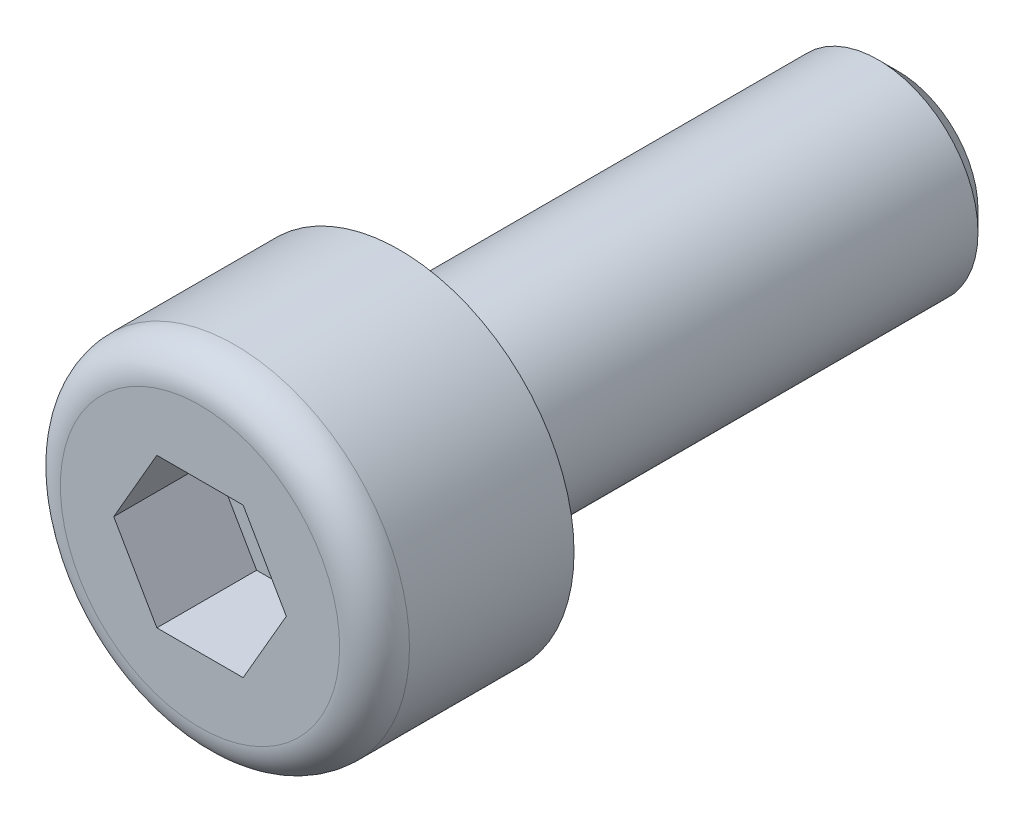
ISO-10303-21;
HEADER;
FILE_DESCRIPTION(('STEP AP214'),'2;1');
FILE_NAME('part.step','',(''),(''),'','','');
FILE_SCHEMA(('AUTOMOTIVE_DESIGN { 1 0 10303 214 1 1 1 1 }'));
ENDSEC;
DATA;
#1=APPLICATION_CONTEXT('core data for automotive mechanical design processes');
#2=APPLICATION_PROTOCOL_DEFINITION('international standard','automotive_design',2000,#1);
#3=PRODUCT_CONTEXT('',#1,'mechanical');
#4=PRODUCT('Part','Part','',(#3));
#5=PRODUCT_RELATED_PRODUCT_CATEGORY('part','',(#4));
#6=PRODUCT_DEFINITION_FORMATION('','',#4);
#7=PRODUCT_DEFINITION_CONTEXT('part definition',#1,'design');
#8=PRODUCT_DEFINITION('design','',#6,#7);
#9=PRODUCT_DEFINITION_SHAPE('','',#8);
#10=(LENGTH_UNIT() NAMED_UNIT(*) SI_UNIT(.MILLI.,.METRE.));
#11=(NAMED_UNIT(*) PLANE_ANGLE_UNIT() SI_UNIT($,.RADIAN.));
#12=(NAMED_UNIT(*) SI_UNIT($,.STERADIAN.) SOLID_ANGLE_UNIT());
#13=UNCERTAINTY_MEASURE_WITH_UNIT(LENGTH_MEASURE(1.E-05),#10,'distance_accuracy_value','');
#14=(GEOMETRIC_REPRESENTATION_CONTEXT(3) GLOBAL_UNCERTAINTY_ASSIGNED_CONTEXT((#13)) GLOBAL_UNIT_ASSIGNED_CONTEXT((#10,
#11,#12)) REPRESENTATION_CONTEXT('',''));
#15=CARTESIAN_POINT('',(0.,0.,0.));
#16=DIRECTION('',(0.,0.,1.));
#17=DIRECTION('',(1.,0.,0.));
#18=AXIS2_PLACEMENT_3D('',#15,#16,#17);
#19=CARTESIAN_POINT('',(0.,0.,-10.));
#20=DIRECTION('',(0.,0.,1.));
#21=DIRECTION('',(1.,0.,0.));
#22=AXIS2_PLACEMENT_3D('',#19,#20,#21);
#23=PLANE('',#22);
#24=CARTESIAN_POINT('',(0.,0.,-10.));
#25=DIRECTION('',(0.,0.,1.));
#26=DIRECTION('',(1.,0.,0.));
#27=AXIS2_PLACEMENT_3D('',#24,#25,#26);
#28=CIRCLE('',#27,1.6);
#29=CARTESIAN_POINT('',(1.6,0.,-10.));
#30=VERTEX_POINT('',#29);
#31=EDGE_CURVE('E10',#30,#30,#28,.T.);
#32=ORIENTED_EDGE('',*,*,#31,.F.);
#33=EDGE_LOOP('',(#32));
#34=FACE_BOUND('',#33,.T.);
#35=ADVANCED_FACE('F16',(#34),#23,.F.);
#36=CARTESIAN_POINT('',(0.,0.,-10.));
#37=DIRECTION('',(0.,0.,1.));
#38=DIRECTION('',(1.,0.,0.));
#39=AXIS2_PLACEMENT_3D('',#36,#37,#38);
#40=CONICAL_SURFACE('',#39,1.6,0.785398163397);
#41=ORIENTED_EDGE('',*,*,#31,.T.);
#42=DIRECTION('',(0.707106781186548,0.,0.707106781186548));
#43=VECTOR('',#42,1.);
#44=CARTESIAN_POINT('',(1.6,0.,-10.));
#45=LINE('',#44,#43);
#46=CARTESIAN_POINT('',(2.,0.,-9.6));
#47=VERTEX_POINT('',#46);
#48=EDGE_CURVE('E27',#30,#47,#45,.T.);
#49=ORIENTED_EDGE('',*,*,#48,.T.);
#50=CARTESIAN_POINT('',(0.,0.,-9.6));
#51=DIRECTION('',(0.,0.,1.));
#52=DIRECTION('',(1.,0.,0.));
#53=AXIS2_PLACEMENT_3D('',#50,#51,#52);
#54=CIRCLE('',#53,2.);
#55=EDGE_CURVE('E148',#47,#47,#54,.T.);
#56=ORIENTED_EDGE('',*,*,#55,.F.);
#57=ORIENTED_EDGE('',*,*,#48,.F.);
#58=EDGE_LOOP('',(#41,#49,#56,#57));
#59=FACE_BOUND('',#58,.T.);
#60=ADVANCED_FACE('F289',(#59),#40,.T.);
#61=CARTESIAN_POINT('',(0.,0.,-9.6));
#62=DIRECTION('',(0.,0.,1.));
#63=DIRECTION('',(1.,0.,0.));
#64=AXIS2_PLACEMENT_3D('',#61,#62,#63);
#65=CYLINDRICAL_SURFACE('',#64,2.);
#66=ORIENTED_EDGE('',*,*,#55,.T.);
#67=DIRECTION('',(0.,0.,1.));
#68=VECTOR('',#67,1.);
#69=CARTESIAN_POINT('',(2.,0.,-9.6));
#70=LINE('',#69,#68);
#71=CARTESIAN_POINT('',(2.,0.,0.));
#72=VERTEX_POINT('',#71);
#73=EDGE_CURVE('E119',#47,#72,#70,.T.);
#74=ORIENTED_EDGE('',*,*,#73,.T.);
#75=CARTESIAN_POINT('',(0.,0.,0.));
#76=DIRECTION('',(0.,0.,1.));
#77=DIRECTION('',(1.,0.,0.));
#78=AXIS2_PLACEMENT_3D('',#75,#76,#77);
#79=CIRCLE('',#78,2.);
#80=EDGE_CURVE('E111',#72,#72,#79,.T.);
#81=ORIENTED_EDGE('',*,*,#80,.F.);
#82=ORIENTED_EDGE('',*,*,#73,.F.);
#83=EDGE_LOOP('',(#66,#74,#81,#82));
#84=FACE_BOUND('',#83,.T.);
#85=ADVANCED_FACE('F329',(#84),#65,.T.);
#86=CARTESIAN_POINT('',(0.,0.,0.));
#87=DIRECTION('',(0.,0.,1.));
#88=DIRECTION('',(1.,0.,0.));
#89=AXIS2_PLACEMENT_3D('',#86,#87,#88);
#90=PLANE('',#89);
#91=ORIENTED_EDGE('',*,*,#80,.T.);
#92=EDGE_LOOP('',(#91));
#93=FACE_BOUND('',#92,.T.);
#94=CARTESIAN_POINT('',(0.,0.,0.));
#95=DIRECTION('',(0.,0.,1.));
#96=DIRECTION('',(1.,0.,0.));
#97=AXIS2_PLACEMENT_3D('',#94,#95,#96);
#98=CIRCLE('',#97,3.5);
#99=CARTESIAN_POINT('',(3.5,0.,0.));
#100=VERTEX_POINT('',#99);
#101=EDGE_CURVE('E105',#100,#100,#98,.T.);
#102=ORIENTED_EDGE('',*,*,#101,.F.);
#103=EDGE_LOOP('',(#102));
#104=FACE_BOUND('',#103,.T.);
#105=ADVANCED_FACE('F106',(#93,#104),#90,.F.);
#106=CARTESIAN_POINT('',(0.,0.,0.));
#107=DIRECTION('',(0.,0.,1.));
#108=DIRECTION('',(1.,0.,0.));
#109=AXIS2_PLACEMENT_3D('',#106,#107,#108);
#110=CYLINDRICAL_SURFACE('',#109,3.5);
#111=ORIENTED_EDGE('',*,*,#101,.T.);
#112=DIRECTION('',(0.,0.,1.));
#113=VECTOR('',#112,1.);
#114=CARTESIAN_POINT('',(3.5,0.,0.));
#115=LINE('',#114,#113);
#116=CARTESIAN_POINT('',(3.5,0.,3.3));
#117=VERTEX_POINT('',#116);
#118=EDGE_CURVE('E112',#100,#117,#115,.T.);
#119=ORIENTED_EDGE('',*,*,#118,.T.);
#120=CARTESIAN_POINT('',(0.,0.,3.3));
#121=DIRECTION('',(0.,0.,1.));
#122=DIRECTION('',(1.,0.,0.));
#123=AXIS2_PLACEMENT_3D('',#120,#121,#122);
#124=CIRCLE('',#123,3.5);
#125=EDGE_CURVE('E122',#117,#117,#124,.T.);
#126=ORIENTED_EDGE('',*,*,#125,.F.);
#127=ORIENTED_EDGE('',*,*,#118,.F.);
#128=EDGE_LOOP('',(#111,#119,#126,#127));
#129=FACE_BOUND('',#128,.T.);
#130=ADVANCED_FACE('F18',(#129),#110,.T.);
#131=CARTESIAN_POINT('',(0.,0.,3.3));
#132=DIRECTION('',(0.,0.,1.));
#133=DIRECTION('',(1.,0.,0.));
#134=AXIS2_PLACEMENT_3D('',#131,#132,#133);
#135=TOROIDAL_SURFACE('',#134,2.8,0.7);
#136=ORIENTED_EDGE('',*,*,#125,.T.);
#137=CARTESIAN_POINT('',(2.8,0.,3.3));
#138=DIRECTION('',(0.,-1.,0.));
#139=DIRECTION('',(1.,0.,0.));
#140=AXIS2_PLACEMENT_3D('',#137,#138,#139);
#141=CIRCLE('',#140,0.7);
#142=CARTESIAN_POINT('',(2.8,0.,4.));
#143=VERTEX_POINT('',#142);
#144=EDGE_CURVE('E160',#117,#143,#141,.T.);
#145=ORIENTED_EDGE('',*,*,#144,.T.);
#146=CARTESIAN_POINT('',(0.,0.,4.));
#147=DIRECTION('',(0.,0.,1.));
#148=DIRECTION('',(1.,0.,0.));
#149=AXIS2_PLACEMENT_3D('',#146,#147,#148);
#150=CIRCLE('',#149,2.8);
#151=EDGE_CURVE('E164',#143,#143,#150,.T.);
#152=ORIENTED_EDGE('',*,*,#151,.F.);
#153=ORIENTED_EDGE('',*,*,#144,.F.);
#154=EDGE_LOOP('',(#136,#145,#152,#153));
#155=FACE_BOUND('',#154,.T.);
#156=ADVANCED_FACE('F257',(#155),#135,.T.);
#157=CARTESIAN_POINT('',(0.,0.,4.));
#158=DIRECTION('',(0.,0.,1.));
#159=DIRECTION('',(1.,0.,0.));
#160=AXIS2_PLACEMENT_3D('',#157,#158,#159);
#161=PLANE('',#160);
#162=ORIENTED_EDGE('',*,*,#151,.T.);
#163=EDGE_LOOP('',(#162));
#164=FACE_BOUND('',#163,.T.);
#165=DIRECTION('',(1.,0.,0.));
#166=VECTOR('',#165,1.);
#167=CARTESIAN_POINT('',(-0.865,-1.498223948547,4.));
#168=LINE('',#167,#166);
#169=CARTESIAN_POINT('',(-0.865,-1.498223948547,4.));
#170=VERTEX_POINT('',#169);
#171=CARTESIAN_POINT('',(0.865,-1.498223948547,4.));
#172=VERTEX_POINT('',#171);
#173=EDGE_CURVE('E131',#170,#172,#168,.T.);
#174=ORIENTED_EDGE('',*,*,#173,.F.);
#175=DIRECTION('',(0.50000000000019,-0.866025403784329,0.));
#176=VECTOR('',#175,1.);
#177=CARTESIAN_POINT('',(-1.73,0.,4.));
#178=LINE('',#177,#176);
#179=CARTESIAN_POINT('',(-1.73,0.,4.));
#180=VERTEX_POINT('',#179);
#181=EDGE_CURVE('E152',#180,#170,#178,.T.);
#182=ORIENTED_EDGE('',*,*,#181,.F.);
#183=DIRECTION('',(-0.50000000000019,-0.866025403784329,0.));
#184=VECTOR('',#183,1.);
#185=CARTESIAN_POINT('',(-0.865,1.498223948547,4.));
#186=LINE('',#185,#184);
#187=CARTESIAN_POINT('',(-0.865,1.498223948547,4.));
#188=VERTEX_POINT('',#187);
#189=EDGE_CURVE('E153',#188,#180,#186,.T.);
#190=ORIENTED_EDGE('',*,*,#189,.F.);
#191=DIRECTION('',(-1.,0.,0.));
#192=VECTOR('',#191,1.);
#193=CARTESIAN_POINT('',(0.865,1.498223948547,4.));
#194=LINE('',#193,#192);
#195=CARTESIAN_POINT('',(0.865,1.498223948547,4.));
#196=VERTEX_POINT('',#195);
#197=EDGE_CURVE('E175',#196,#188,#194,.T.);
#198=ORIENTED_EDGE('',*,*,#197,.F.);
#199=DIRECTION('',(-0.50000000000019,0.866025403784329,0.));
#200=VECTOR('',#199,1.);
#201=CARTESIAN_POINT('',(1.73,0.,4.));
#202=LINE('',#201,#200);
#203=CARTESIAN_POINT('',(1.73,0.,4.));
#204=VERTEX_POINT('',#203);
#205=EDGE_CURVE('E132',#204,#196,#202,.T.);
#206=ORIENTED_EDGE('',*,*,#205,.F.);
#207=DIRECTION('',(0.50000000000019,0.866025403784329,0.));
#208=VECTOR('',#207,1.);
#209=CARTESIAN_POINT('',(0.865,-1.498223948547,4.));
#210=LINE('',#209,#208);
#211=EDGE_CURVE('E130',#172,#204,#210,.T.);
#212=ORIENTED_EDGE('',*,*,#211,.F.);
#213=EDGE_LOOP('',(#174,#182,#190,#198,#206,#212));
#214=FACE_BOUND('',#213,.T.);
#215=ADVANCED_FACE('F225',(#164,#214),#161,.T.);
#216=CARTESIAN_POINT('',(0.865,-1.498223948547,2.));
#217=DIRECTION('',(-0.866025403784329,0.50000000000019,0.));
#218=DIRECTION('',(0.,0.,1.));
#219=AXIS2_PLACEMENT_3D('',#216,#217,#218);
#220=PLANE('',#219);
#221=DIRECTION('',(0.,0.,1.));
#222=VECTOR('',#221,1.);
#223=CARTESIAN_POINT('',(0.865,-1.498223948547,2.));
#224=LINE('',#223,#222);
#225=CARTESIAN_POINT('',(0.865,-1.498223948547,2.));
#226=VERTEX_POINT('',#225);
#227=EDGE_CURVE('E141',#226,#172,#224,.T.);
#228=ORIENTED_EDGE('',*,*,#227,.T.);
#229=ORIENTED_EDGE('',*,*,#211,.T.);
#230=DIRECTION('',(0.,0.,1.));
#231=VECTOR('',#230,1.);
#232=CARTESIAN_POINT('',(1.73,0.,2.));
#233=LINE('',#232,#231);
#234=CARTESIAN_POINT('',(1.73,0.,2.));
#235=VERTEX_POINT('',#234);
#236=EDGE_CURVE('E136',#235,#204,#233,.T.);
#237=ORIENTED_EDGE('',*,*,#236,.F.);
#238=DIRECTION('',(0.50000000000019,0.866025403784329,0.));
#239=VECTOR('',#238,1.);
#240=CARTESIAN_POINT('',(0.865,-1.498223948547,2.));
#241=LINE('',#240,#239);
#242=EDGE_CURVE('E20',#226,#235,#241,.T.);
#243=ORIENTED_EDGE('',*,*,#242,.F.);
#244=EDGE_LOOP('',(#228,#229,#237,#243));
#245=FACE_BOUND('',#244,.T.);
#246=ADVANCED_FACE('F233',(#245),#220,.T.);
#247=CARTESIAN_POINT('',(-0.865,-1.498223948547,2.));
#248=DIRECTION('',(0.,1.,0.));
#249=DIRECTION('',(1.,0.,0.));
#250=AXIS2_PLACEMENT_3D('',#247,#248,#249);
#251=PLANE('',#250);
#252=DIRECTION('',(0.,0.,1.));
#253=VECTOR('',#252,1.);
#254=CARTESIAN_POINT('',(-0.865,-1.498223948547,2.));
#255=LINE('',#254,#253);
#256=CARTESIAN_POINT('',(-0.865,-1.498223948547,2.));
#257=VERTEX_POINT('',#256);
#258=EDGE_CURVE('E127',#257,#170,#255,.T.);
#259=ORIENTED_EDGE('',*,*,#258,.T.);
#260=ORIENTED_EDGE('',*,*,#173,.T.);
#261=ORIENTED_EDGE('',*,*,#227,.F.);
#262=DIRECTION('',(1.,0.,0.));
#263=VECTOR('',#262,1.);
#264=CARTESIAN_POINT('',(-0.865,-1.498223948547,2.));
#265=LINE('',#264,#263);
#266=EDGE_CURVE('E190',#257,#226,#265,.T.);
#267=ORIENTED_EDGE('',*,*,#266,.F.);
#268=EDGE_LOOP('',(#259,#260,#261,#267));
#269=FACE_BOUND('',#268,.T.);
#270=ADVANCED_FACE('F231',(#269),#251,.T.);
#271=CARTESIAN_POINT('',(-1.73,0.,2.));
#272=DIRECTION('',(0.866025403784329,0.50000000000019,0.));
#273=DIRECTION('',(0.,0.,-1.));
#274=AXIS2_PLACEMENT_3D('',#271,#272,#273);
#275=PLANE('',#274);
#276=DIRECTION('',(0.,0.,1.));
#277=VECTOR('',#276,1.);
#278=CARTESIAN_POINT('',(-1.73,0.,2.));
#279=LINE('',#278,#277);
#280=CARTESIAN_POINT('',(-1.73,0.,2.));
#281=VERTEX_POINT('',#280);
#282=EDGE_CURVE('E144',#281,#180,#279,.T.);
#283=ORIENTED_EDGE('',*,*,#282,.T.);
#284=ORIENTED_EDGE('',*,*,#181,.T.);
#285=ORIENTED_EDGE('',*,*,#258,.F.);
#286=DIRECTION('',(0.50000000000019,-0.866025403784329,0.));
#287=VECTOR('',#286,1.);
#288=CARTESIAN_POINT('',(-1.73,0.,2.));
#289=LINE('',#288,#287);
#290=EDGE_CURVE('E177',#281,#257,#289,.T.);
#291=ORIENTED_EDGE('',*,*,#290,.F.);
#292=EDGE_LOOP('',(#283,#284,#285,#291));
#293=FACE_BOUND('',#292,.T.);
#294=ADVANCED_FACE('F222',(#293),#275,.T.);
#295=CARTESIAN_POINT('',(-0.865,1.498223948547,2.));
#296=DIRECTION('',(0.866025403784329,-0.50000000000019,0.));
#297=DIRECTION('',(0.,0.,-1.));
#298=AXIS2_PLACEMENT_3D('',#295,#296,#297);
#299=PLANE('',#298);
#300=DIRECTION('',(0.,0.,1.));
#301=VECTOR('',#300,1.);
#302=CARTESIAN_POINT('',(-0.865,1.498223948547,2.));
#303=LINE('',#302,#301);
#304=CARTESIAN_POINT('',(-0.865,1.498223948547,2.));
#305=VERTEX_POINT('',#304);
#306=EDGE_CURVE('E149',#305,#188,#303,.T.);
#307=ORIENTED_EDGE('',*,*,#306,.T.);
#308=ORIENTED_EDGE('',*,*,#189,.T.);
#309=ORIENTED_EDGE('',*,*,#282,.F.);
#310=DIRECTION('',(-0.50000000000019,-0.866025403784329,0.));
#311=VECTOR('',#310,1.);
#312=CARTESIAN_POINT('',(-0.865,1.498223948547,2.));
#313=LINE('',#312,#311);
#314=EDGE_CURVE('E88',#305,#281,#313,.T.);
#315=ORIENTED_EDGE('',*,*,#314,.F.);
#316=EDGE_LOOP('',(#307,#308,#309,#315));
#317=FACE_BOUND('',#316,.T.);
#318=ADVANCED_FACE('F223',(#317),#299,.T.);
#319=CARTESIAN_POINT('',(0.865,1.498223948547,2.));
#320=DIRECTION('',(0.,-1.,0.));
#321=DIRECTION('',(-1.,0.,0.));
#322=AXIS2_PLACEMENT_3D('',#319,#320,#321);
#323=PLANE('',#322);
#324=DIRECTION('',(0.,0.,1.));
#325=VECTOR('',#324,1.);
#326=CARTESIAN_POINT('',(0.865,1.498223948547,2.));
#327=LINE('',#326,#325);
#328=CARTESIAN_POINT('',(0.865,1.498223948547,2.));
#329=VERTEX_POINT('',#328);
#330=EDGE_CURVE('E171',#329,#196,#327,.T.);
#331=ORIENTED_EDGE('',*,*,#330,.T.);
#332=ORIENTED_EDGE('',*,*,#197,.T.);
#333=ORIENTED_EDGE('',*,*,#306,.F.);
#334=DIRECTION('',(-1.,0.,0.));
#335=VECTOR('',#334,1.);
#336=CARTESIAN_POINT('',(0.865,1.498223948547,2.));
#337=LINE('',#336,#335);
#338=EDGE_CURVE('E76',#329,#305,#337,.T.);
#339=ORIENTED_EDGE('',*,*,#338,.F.);
#340=EDGE_LOOP('',(#331,#332,#333,#339));
#341=FACE_BOUND('',#340,.T.);
#342=ADVANCED_FACE('F317',(#341),#323,.T.);
#343=CARTESIAN_POINT('',(1.73,0.,2.));
#344=DIRECTION('',(-0.866025403784329,-0.50000000000019,0.));
#345=DIRECTION('',(-0.50000000000019,0.866025403784329,0.));
#346=AXIS2_PLACEMENT_3D('',#343,#344,#345);
#347=PLANE('',#346);
#348=ORIENTED_EDGE('',*,*,#236,.T.);
#349=ORIENTED_EDGE('',*,*,#205,.T.);
#350=ORIENTED_EDGE('',*,*,#330,.F.);
#351=DIRECTION('',(-0.50000000000019,0.866025403784329,0.));
#352=VECTOR('',#351,1.);
#353=CARTESIAN_POINT('',(1.73,0.,2.));
#354=LINE('',#353,#352);
#355=EDGE_CURVE('E137',#235,#329,#354,.T.);
#356=ORIENTED_EDGE('',*,*,#355,.F.);
#357=EDGE_LOOP('',(#348,#349,#350,#356));
#358=FACE_BOUND('',#357,.T.);
#359=ADVANCED_FACE('F244',(#358),#347,.T.);
#360=CARTESIAN_POINT('',(0.,0.,2.));
#361=DIRECTION('',(0.,0.,1.));
#362=DIRECTION('',(1.,0.,0.));
#363=AXIS2_PLACEMENT_3D('',#360,#361,#362);
#364=PLANE('',#363);
#365=ORIENTED_EDGE('',*,*,#355,.T.);
#366=ORIENTED_EDGE('',*,*,#338,.T.);
#367=ORIENTED_EDGE('',*,*,#314,.T.);
#368=ORIENTED_EDGE('',*,*,#290,.T.);
#369=ORIENTED_EDGE('',*,*,#266,.T.);
#370=ORIENTED_EDGE('',*,*,#242,.T.);
#371=EDGE_LOOP('',(#365,#366,#367,#368,#369,#370));
#372=FACE_BOUND('',#371,.T.);
#373=ADVANCED_FACE('F187',(#372),#364,.T.);
#374=CLOSED_SHELL('',(#35,#60,#85,#105,#130,#156,#215,#246,#270,#294,#318,#342,#359,#373));
#375=MANIFOLD_SOLID_BREP('B1',#374);
#376=ADVANCED_BREP_SHAPE_REPRESENTATION('',(#18,#375),#14);
#377=SHAPE_DEFINITION_REPRESENTATION(#9,#376);
ENDSEC;
END-ISO-10303-21;
